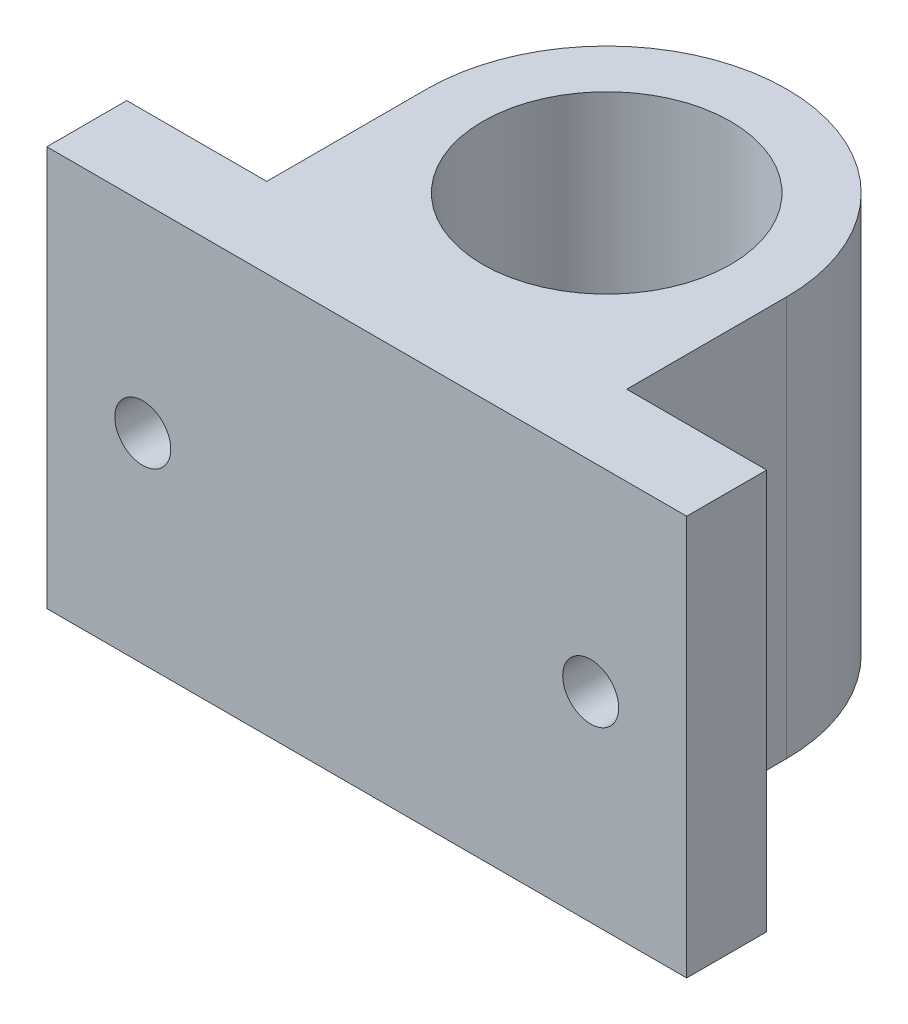
ISO-10303-21;
HEADER;
FILE_DESCRIPTION(('STEP AP214'),'2;1');
FILE_NAME('part.step','',(''),(''),'','','');
FILE_SCHEMA(('AUTOMOTIVE_DESIGN { 1 0 10303 214 1 1 1 1 }'));
ENDSEC;
DATA;
#1=APPLICATION_CONTEXT('core data for automotive mechanical design processes');
#2=APPLICATION_PROTOCOL_DEFINITION('international standard','automotive_design',2000,#1);
#3=PRODUCT_CONTEXT('',#1,'mechanical');
#4=PRODUCT('Part','Part','',(#3));
#5=PRODUCT_RELATED_PRODUCT_CATEGORY('part','',(#4));
#6=PRODUCT_DEFINITION_FORMATION('','',#4);
#7=PRODUCT_DEFINITION_CONTEXT('part definition',#1,'design');
#8=PRODUCT_DEFINITION('design','',#6,#7);
#9=PRODUCT_DEFINITION_SHAPE('','',#8);
#10=(LENGTH_UNIT() NAMED_UNIT(*) SI_UNIT(.MILLI.,.METRE.));
#11=(NAMED_UNIT(*) PLANE_ANGLE_UNIT() SI_UNIT($,.RADIAN.));
#12=(NAMED_UNIT(*) SI_UNIT($,.STERADIAN.) SOLID_ANGLE_UNIT());
#13=UNCERTAINTY_MEASURE_WITH_UNIT(LENGTH_MEASURE(1.E-05),#10,'distance_accuracy_value','');
#14=(GEOMETRIC_REPRESENTATION_CONTEXT(3) GLOBAL_UNCERTAINTY_ASSIGNED_CONTEXT((#13)) GLOBAL_UNIT_ASSIGNED_CONTEXT((#10,
#11,#12)) REPRESENTATION_CONTEXT('',''));
#15=CARTESIAN_POINT('',(0.,0.,0.));
#16=DIRECTION('',(0.,0.,1.));
#17=DIRECTION('',(1.,0.,0.));
#18=AXIS2_PLACEMENT_3D('',#15,#16,#17);
#19=CARTESIAN_POINT('',(21.3440860215054,25.,-11.1129032258065));
#20=DIRECTION('',(0.,1.,0.));
#21=DIRECTION('',(0.,0.,1.));
#22=AXIS2_PLACEMENT_3D('',#19,#20,#21);
#23=PLANE('',#22);
#24=DIRECTION('',(0.,0.,1.));
#25=VECTOR('',#24,1.);
#26=CARTESIAN_POINT('',(1.34408602150537,25.,-1.11290322580645));
#27=LINE('',#26,#25);
#28=CARTESIAN_POINT('',(1.34408602150537,25.,-1.11290322580645));
#29=VERTEX_POINT('',#28);
#30=CARTESIAN_POINT('',(1.34408602150537,25.,3.88709677419355));
#31=VERTEX_POINT('',#30);
#32=EDGE_CURVE('E147',#29,#31,#27,.T.);
#33=ORIENTED_EDGE('',*,*,#32,.T.);
#34=DIRECTION('',(1.,0.,0.));
#35=VECTOR('',#34,1.);
#36=CARTESIAN_POINT('',(1.34408602150537,25.,3.88709677419355));
#37=LINE('',#36,#35);
#38=CARTESIAN_POINT('',(41.3440860215054,25.,3.88709677419355));
#39=VERTEX_POINT('',#38);
#40=EDGE_CURVE('E95',#31,#39,#37,.T.);
#41=ORIENTED_EDGE('',*,*,#40,.T.);
#42=DIRECTION('',(0.,0.,-1.));
#43=VECTOR('',#42,1.);
#44=CARTESIAN_POINT('',(41.3440860215054,25.,-1.11290322580645));
#45=LINE('',#44,#43);
#46=CARTESIAN_POINT('',(41.3440860215054,25.,-1.11290322580645));
#47=VERTEX_POINT('',#46);
#48=EDGE_CURVE('E162',#39,#47,#45,.T.);
#49=ORIENTED_EDGE('',*,*,#48,.T.);
#50=DIRECTION('',(-1.,0.,0.));
#51=VECTOR('',#50,1.);
#52=CARTESIAN_POINT('',(32.5940860215054,25.,-1.11290322580645));
#53=LINE('',#52,#51);
#54=CARTESIAN_POINT('',(32.5940860215054,25.,-1.11290322580645));
#55=VERTEX_POINT('',#54);
#56=EDGE_CURVE('E175',#47,#55,#53,.T.);
#57=ORIENTED_EDGE('',*,*,#56,.T.);
#58=DIRECTION('',(0.,0.,-1.));
#59=VECTOR('',#58,1.);
#60=CARTESIAN_POINT('',(32.5940860215054,25.,-11.1129032258064));
#61=LINE('',#60,#59);
#62=CARTESIAN_POINT('',(32.5940860215054,25.,-11.1129032258065));
#63=VERTEX_POINT('',#62);
#64=EDGE_CURVE('E114',#55,#63,#61,.T.);
#65=ORIENTED_EDGE('',*,*,#64,.T.);
#66=CARTESIAN_POINT('',(21.3440860215054,25.,-11.1129032258065));
#67=DIRECTION('',(0.,1.,0.));
#68=DIRECTION('',(0.,0.,1.));
#69=AXIS2_PLACEMENT_3D('',#66,#67,#68);
#70=CIRCLE('',#69,11.25);
#71=CARTESIAN_POINT('',(10.0940860215054,25.,-11.1129032258064));
#72=VERTEX_POINT('',#71);
#73=EDGE_CURVE('E108',#63,#72,#70,.T.);
#74=ORIENTED_EDGE('',*,*,#73,.T.);
#75=DIRECTION('',(0.,0.,1.));
#76=VECTOR('',#75,1.);
#77=CARTESIAN_POINT('',(10.0940860215054,25.,-11.1129032258064));
#78=LINE('',#77,#76);
#79=CARTESIAN_POINT('',(10.0940860215054,25.,-1.11290322580645));
#80=VERTEX_POINT('',#79);
#81=EDGE_CURVE('E112',#72,#80,#78,.T.);
#82=ORIENTED_EDGE('',*,*,#81,.T.);
#83=DIRECTION('',(-1.,0.,0.));
#84=VECTOR('',#83,1.);
#85=CARTESIAN_POINT('',(1.34408602150537,25.,-1.11290322580645));
#86=LINE('',#85,#84);
#87=EDGE_CURVE('E52',#80,#29,#86,.T.);
#88=ORIENTED_EDGE('',*,*,#87,.T.);
#89=EDGE_LOOP('',(#33,#41,#49,#57,#65,#74,#82,#88));
#90=FACE_BOUND('',#89,.T.);
#91=CARTESIAN_POINT('',(21.3440860215054,25.,-11.1129032258065));
#92=DIRECTION('',(0.,1.,0.));
#93=DIRECTION('',(0.,0.,1.));
#94=AXIS2_PLACEMENT_3D('',#91,#92,#93);
#95=CIRCLE('',#94,7.75);
#96=CARTESIAN_POINT('',(21.3440860215054,25.,-3.36290322580645));
#97=VERTEX_POINT('',#96);
#98=EDGE_CURVE('E136',#97,#97,#95,.T.);
#99=ORIENTED_EDGE('',*,*,#98,.F.);
#100=EDGE_LOOP('',(#99));
#101=FACE_BOUND('',#100,.T.);
#102=ADVANCED_FACE('F35',(#90,#101),#23,.T.);
#103=CARTESIAN_POINT('',(21.3440860215054,0.,-11.1129032258065));
#104=DIRECTION('',(0.,1.,0.));
#105=DIRECTION('',(0.,0.,1.));
#106=AXIS2_PLACEMENT_3D('',#103,#104,#105);
#107=PLANE('',#106);
#108=DIRECTION('',(0.,0.,1.));
#109=VECTOR('',#108,1.);
#110=CARTESIAN_POINT('',(1.34408602150537,0.,-1.11290322580645));
#111=LINE('',#110,#109);
#112=CARTESIAN_POINT('',(1.34408602150537,0.,-1.11290322580645));
#113=VERTEX_POINT('',#112);
#114=CARTESIAN_POINT('',(1.34408602150537,0.,3.88709677419355));
#115=VERTEX_POINT('',#114);
#116=EDGE_CURVE('E132',#113,#115,#111,.T.);
#117=ORIENTED_EDGE('',*,*,#116,.F.);
#118=DIRECTION('',(-1.,0.,0.));
#119=VECTOR('',#118,1.);
#120=CARTESIAN_POINT('',(1.34408602150537,0.,-1.11290322580645));
#121=LINE('',#120,#119);
#122=CARTESIAN_POINT('',(10.0940860215054,0.,-1.11290322580645));
#123=VERTEX_POINT('',#122);
#124=EDGE_CURVE('E87',#123,#113,#121,.T.);
#125=ORIENTED_EDGE('',*,*,#124,.F.);
#126=DIRECTION('',(0.,0.,1.));
#127=VECTOR('',#126,1.);
#128=CARTESIAN_POINT('',(10.0940860215054,0.,-11.1129032258064));
#129=LINE('',#128,#127);
#130=CARTESIAN_POINT('',(10.0940860215054,0.,-11.1129032258064));
#131=VERTEX_POINT('',#130);
#132=EDGE_CURVE('E81',#131,#123,#129,.T.);
#133=ORIENTED_EDGE('',*,*,#132,.F.);
#134=CARTESIAN_POINT('',(21.3440860215054,0.,-11.1129032258065));
#135=DIRECTION('',(0.,1.,0.));
#136=DIRECTION('',(0.,0.,1.));
#137=AXIS2_PLACEMENT_3D('',#134,#135,#136);
#138=CIRCLE('',#137,11.25);
#139=CARTESIAN_POINT('',(32.5940860215054,0.,-11.1129032258065));
#140=VERTEX_POINT('',#139);
#141=EDGE_CURVE('E122',#140,#131,#138,.T.);
#142=ORIENTED_EDGE('',*,*,#141,.F.);
#143=DIRECTION('',(0.,0.,-1.));
#144=VECTOR('',#143,1.);
#145=CARTESIAN_POINT('',(32.5940860215054,0.,-11.1129032258064));
#146=LINE('',#145,#144);
#147=CARTESIAN_POINT('',(32.5940860215054,0.,-1.11290322580645));
#148=VERTEX_POINT('',#147);
#149=EDGE_CURVE('E142',#148,#140,#146,.T.);
#150=ORIENTED_EDGE('',*,*,#149,.F.);
#151=DIRECTION('',(-1.,0.,0.));
#152=VECTOR('',#151,1.);
#153=CARTESIAN_POINT('',(32.5940860215054,0.,-1.11290322580645));
#154=LINE('',#153,#152);
#155=CARTESIAN_POINT('',(41.3440860215054,0.,-1.11290322580645));
#156=VERTEX_POINT('',#155);
#157=EDGE_CURVE('E140',#156,#148,#154,.T.);
#158=ORIENTED_EDGE('',*,*,#157,.F.);
#159=DIRECTION('',(0.,0.,-1.));
#160=VECTOR('',#159,1.);
#161=CARTESIAN_POINT('',(41.3440860215054,0.,-1.11290322580645));
#162=LINE('',#161,#160);
#163=CARTESIAN_POINT('',(41.3440860215054,0.,3.88709677419355));
#164=VERTEX_POINT('',#163);
#165=EDGE_CURVE('E138',#164,#156,#162,.T.);
#166=ORIENTED_EDGE('',*,*,#165,.F.);
#167=DIRECTION('',(1.,0.,0.));
#168=VECTOR('',#167,1.);
#169=CARTESIAN_POINT('',(1.34408602150537,0.,3.88709677419355));
#170=LINE('',#169,#168);
#171=EDGE_CURVE('E135',#115,#164,#170,.T.);
#172=ORIENTED_EDGE('',*,*,#171,.F.);
#173=EDGE_LOOP('',(#117,#125,#133,#142,#150,#158,#166,#172));
#174=FACE_BOUND('',#173,.T.);
#175=CARTESIAN_POINT('',(21.3440860215054,0.,-11.1129032258065));
#176=DIRECTION('',(0.,1.,0.));
#177=DIRECTION('',(0.,0.,1.));
#178=AXIS2_PLACEMENT_3D('',#175,#176,#177);
#179=CIRCLE('',#178,7.75);
#180=CARTESIAN_POINT('',(21.3440860215054,0.,-3.36290322580645));
#181=VERTEX_POINT('',#180);
#182=EDGE_CURVE('E181',#181,#181,#179,.T.);
#183=ORIENTED_EDGE('',*,*,#182,.T.);
#184=EDGE_LOOP('',(#183));
#185=FACE_BOUND('',#184,.T.);
#186=ADVANCED_FACE('F166',(#174,#185),#107,.F.);
#187=CARTESIAN_POINT('',(1.34408602150537,25.,-1.11290322580645));
#188=DIRECTION('',(1.,0.,0.));
#189=DIRECTION('',(0.,0.,-1.));
#190=AXIS2_PLACEMENT_3D('',#187,#188,#189);
#191=PLANE('',#190);
#192=ORIENTED_EDGE('',*,*,#116,.T.);
#193=DIRECTION('',(0.,-1.,0.));
#194=VECTOR('',#193,1.);
#195=CARTESIAN_POINT('',(1.34408602150537,25.,3.88709677419355));
#196=LINE('',#195,#194);
#197=EDGE_CURVE('E11',#31,#115,#196,.T.);
#198=ORIENTED_EDGE('',*,*,#197,.F.);
#199=ORIENTED_EDGE('',*,*,#32,.F.);
#200=DIRECTION('',(0.,-1.,0.));
#201=VECTOR('',#200,1.);
#202=CARTESIAN_POINT('',(1.34408602150537,25.,-1.11290322580645));
#203=LINE('',#202,#201);
#204=EDGE_CURVE('E128',#29,#113,#203,.T.);
#205=ORIENTED_EDGE('',*,*,#204,.T.);
#206=EDGE_LOOP('',(#192,#198,#199,#205));
#207=FACE_BOUND('',#206,.T.);
#208=ADVANCED_FACE('F37',(#207),#191,.F.);
#209=CARTESIAN_POINT('',(1.34408602150537,25.,3.88709677419355));
#210=DIRECTION('',(0.,0.,-1.));
#211=DIRECTION('',(-1.,0.,0.));
#212=AXIS2_PLACEMENT_3D('',#209,#210,#211);
#213=PLANE('',#212);
#214=CARTESIAN_POINT('',(35.3440860215054,12.5,3.88709677419355));
#215=DIRECTION('',(0.,0.,-1.));
#216=DIRECTION('',(-1.,0.,0.));
#217=AXIS2_PLACEMENT_3D('',#214,#215,#216);
#218=CIRCLE('',#217,1.75);
#219=CARTESIAN_POINT('',(33.5940860215054,12.5,3.88709677419355));
#220=VERTEX_POINT('',#219);
#221=EDGE_CURVE('E184',#220,#220,#218,.T.);
#222=ORIENTED_EDGE('',*,*,#221,.T.);
#223=EDGE_LOOP('',(#222));
#224=FACE_BOUND('',#223,.T.);
#225=CARTESIAN_POINT('',(7.34408602150538,12.5,3.88709677419355));
#226=DIRECTION('',(0.,0.,-1.));
#227=DIRECTION('',(-1.,0.,0.));
#228=AXIS2_PLACEMENT_3D('',#225,#226,#227);
#229=CIRCLE('',#228,1.75);
#230=CARTESIAN_POINT('',(5.59408602150538,12.5,3.88709677419355));
#231=VERTEX_POINT('',#230);
#232=EDGE_CURVE('E190',#231,#231,#229,.T.);
#233=ORIENTED_EDGE('',*,*,#232,.T.);
#234=EDGE_LOOP('',(#233));
#235=FACE_BOUND('',#234,.T.);
#236=ORIENTED_EDGE('',*,*,#171,.T.);
#237=DIRECTION('',(0.,-1.,0.));
#238=VECTOR('',#237,1.);
#239=CARTESIAN_POINT('',(41.3440860215054,25.,3.88709677419355));
#240=LINE('',#239,#238);
#241=EDGE_CURVE('E44',#39,#164,#240,.T.);
#242=ORIENTED_EDGE('',*,*,#241,.F.);
#243=ORIENTED_EDGE('',*,*,#40,.F.);
#244=ORIENTED_EDGE('',*,*,#197,.T.);
#245=EDGE_LOOP('',(#236,#242,#243,#244));
#246=FACE_BOUND('',#245,.T.);
#247=ADVANCED_FACE('F199',(#224,#235,#246),#213,.F.);
#248=CARTESIAN_POINT('',(41.3440860215054,25.,-1.11290322580645));
#249=DIRECTION('',(-1.,0.,0.));
#250=DIRECTION('',(0.,0.,1.));
#251=AXIS2_PLACEMENT_3D('',#248,#249,#250);
#252=PLANE('',#251);
#253=ORIENTED_EDGE('',*,*,#165,.T.);
#254=DIRECTION('',(0.,-1.,0.));
#255=VECTOR('',#254,1.);
#256=CARTESIAN_POINT('',(41.3440860215054,25.,-1.11290322580645));
#257=LINE('',#256,#255);
#258=EDGE_CURVE('E154',#47,#156,#257,.T.);
#259=ORIENTED_EDGE('',*,*,#258,.F.);
#260=ORIENTED_EDGE('',*,*,#48,.F.);
#261=ORIENTED_EDGE('',*,*,#241,.T.);
#262=EDGE_LOOP('',(#253,#259,#260,#261));
#263=FACE_BOUND('',#262,.T.);
#264=ADVANCED_FACE('F160',(#263),#252,.F.);
#265=CARTESIAN_POINT('',(32.5940860215054,25.,-1.11290322580645));
#266=DIRECTION('',(0.,0.,1.));
#267=DIRECTION('',(1.,0.,0.));
#268=AXIS2_PLACEMENT_3D('',#265,#266,#267);
#269=PLANE('',#268);
#270=CARTESIAN_POINT('',(35.3440860215054,12.5,-1.11290322580645));
#271=DIRECTION('',(0.,0.,-1.));
#272=DIRECTION('',(-1.,0.,0.));
#273=AXIS2_PLACEMENT_3D('',#270,#271,#272);
#274=CIRCLE('',#273,1.75);
#275=CARTESIAN_POINT('',(33.5940860215054,12.5,-1.11290322580645));
#276=VERTEX_POINT('',#275);
#277=EDGE_CURVE('E193',#276,#276,#274,.T.);
#278=ORIENTED_EDGE('',*,*,#277,.F.);
#279=EDGE_LOOP('',(#278));
#280=FACE_BOUND('',#279,.T.);
#281=ORIENTED_EDGE('',*,*,#157,.T.);
#282=DIRECTION('',(0.,-1.,0.));
#283=VECTOR('',#282,1.);
#284=CARTESIAN_POINT('',(32.5940860215054,25.,-1.11290322580645));
#285=LINE('',#284,#283);
#286=EDGE_CURVE('E151',#55,#148,#285,.T.);
#287=ORIENTED_EDGE('',*,*,#286,.F.);
#288=ORIENTED_EDGE('',*,*,#56,.F.);
#289=ORIENTED_EDGE('',*,*,#258,.T.);
#290=EDGE_LOOP('',(#281,#287,#288,#289));
#291=FACE_BOUND('',#290,.T.);
#292=ADVANCED_FACE('F171',(#280,#291),#269,.F.);
#293=CARTESIAN_POINT('',(32.5940860215054,25.,-11.1129032258064));
#294=DIRECTION('',(-1.,0.,0.));
#295=DIRECTION('',(0.,0.,1.));
#296=AXIS2_PLACEMENT_3D('',#293,#294,#295);
#297=PLANE('',#296);
#298=ORIENTED_EDGE('',*,*,#149,.T.);
#299=DIRECTION('',(0.,-1.,0.));
#300=VECTOR('',#299,1.);
#301=CARTESIAN_POINT('',(32.5940860215054,25.,-11.1129032258065));
#302=LINE('',#301,#300);
#303=EDGE_CURVE('E123',#63,#140,#302,.T.);
#304=ORIENTED_EDGE('',*,*,#303,.F.);
#305=ORIENTED_EDGE('',*,*,#64,.F.);
#306=ORIENTED_EDGE('',*,*,#286,.T.);
#307=EDGE_LOOP('',(#298,#304,#305,#306));
#308=FACE_BOUND('',#307,.T.);
#309=ADVANCED_FACE('F174',(#308),#297,.F.);
#310=CARTESIAN_POINT('',(21.3440860215054,25.,-11.1129032258065));
#311=DIRECTION('',(0.,-1.,0.));
#312=DIRECTION('',(0.,0.,-1.));
#313=AXIS2_PLACEMENT_3D('',#310,#311,#312);
#314=CYLINDRICAL_SURFACE('',#313,11.25);
#315=ORIENTED_EDGE('',*,*,#141,.T.);
#316=DIRECTION('',(0.,-1.,0.));
#317=VECTOR('',#316,1.);
#318=CARTESIAN_POINT('',(10.0940860215054,25.,-11.1129032258064));
#319=LINE('',#318,#317);
#320=EDGE_CURVE('E119',#72,#131,#319,.T.);
#321=ORIENTED_EDGE('',*,*,#320,.F.);
#322=ORIENTED_EDGE('',*,*,#73,.F.);
#323=ORIENTED_EDGE('',*,*,#303,.T.);
#324=EDGE_LOOP('',(#315,#321,#322,#323));
#325=FACE_BOUND('',#324,.T.);
#326=ADVANCED_FACE('F120',(#325),#314,.T.);
#327=CARTESIAN_POINT('',(10.0940860215054,25.,-11.1129032258064));
#328=DIRECTION('',(1.,0.,0.));
#329=DIRECTION('',(0.,0.,-1.));
#330=AXIS2_PLACEMENT_3D('',#327,#328,#329);
#331=PLANE('',#330);
#332=ORIENTED_EDGE('',*,*,#132,.T.);
#333=DIRECTION('',(0.,-1.,0.));
#334=VECTOR('',#333,1.);
#335=CARTESIAN_POINT('',(10.0940860215054,25.,-1.11290322580645));
#336=LINE('',#335,#334);
#337=EDGE_CURVE('E124',#80,#123,#336,.T.);
#338=ORIENTED_EDGE('',*,*,#337,.F.);
#339=ORIENTED_EDGE('',*,*,#81,.F.);
#340=ORIENTED_EDGE('',*,*,#320,.T.);
#341=EDGE_LOOP('',(#332,#338,#339,#340));
#342=FACE_BOUND('',#341,.T.);
#343=ADVANCED_FACE('F126',(#342),#331,.F.);
#344=CARTESIAN_POINT('',(1.34408602150537,25.,-1.11290322580645));
#345=DIRECTION('',(0.,0.,1.));
#346=DIRECTION('',(1.,0.,0.));
#347=AXIS2_PLACEMENT_3D('',#344,#345,#346);
#348=PLANE('',#347);
#349=CARTESIAN_POINT('',(7.34408602150538,12.5,-1.11290322580645));
#350=DIRECTION('',(0.,0.,-1.));
#351=DIRECTION('',(-1.,0.,0.));
#352=AXIS2_PLACEMENT_3D('',#349,#350,#351);
#353=CIRCLE('',#352,1.75);
#354=CARTESIAN_POINT('',(5.59408602150538,12.5,-1.11290322580645));
#355=VERTEX_POINT('',#354);
#356=EDGE_CURVE('E187',#355,#355,#353,.T.);
#357=ORIENTED_EDGE('',*,*,#356,.F.);
#358=EDGE_LOOP('',(#357));
#359=FACE_BOUND('',#358,.T.);
#360=ORIENTED_EDGE('',*,*,#124,.T.);
#361=ORIENTED_EDGE('',*,*,#204,.F.);
#362=ORIENTED_EDGE('',*,*,#87,.F.);
#363=ORIENTED_EDGE('',*,*,#337,.T.);
#364=EDGE_LOOP('',(#360,#361,#362,#363));
#365=FACE_BOUND('',#364,.T.);
#366=ADVANCED_FACE('F227',(#359,#365),#348,.F.);
#367=CARTESIAN_POINT('',(21.3440860215054,25.,-11.1129032258065));
#368=DIRECTION('',(0.,-1.,0.));
#369=DIRECTION('',(0.,0.,-1.));
#370=AXIS2_PLACEMENT_3D('',#367,#368,#369);
#371=CYLINDRICAL_SURFACE('',#370,7.75);
#372=ORIENTED_EDGE('',*,*,#98,.T.);
#373=EDGE_LOOP('',(#372));
#374=FACE_BOUND('',#373,.T.);
#375=ORIENTED_EDGE('',*,*,#182,.F.);
#376=EDGE_LOOP('',(#375));
#377=FACE_BOUND('',#376,.T.);
#378=ADVANCED_FACE('F224',(#374,#377),#371,.F.);
#379=CARTESIAN_POINT('',(7.34408602150538,12.5,3.88709677419355));
#380=DIRECTION('',(0.,0.,-1.));
#381=DIRECTION('',(-1.,0.,0.));
#382=AXIS2_PLACEMENT_3D('',#379,#380,#381);
#383=CYLINDRICAL_SURFACE('',#382,1.75);
#384=CARTESIAN_POINT('',(5.59408602150538,12.5,3.88709677419355));
#385=CARTESIAN_POINT('',(5.59408602150538,12.5,3.83501344086022));
#386=CARTESIAN_POINT('',(5.59408602150538,12.5,3.78293010752688));
#387=CARTESIAN_POINT('',(5.59408602150538,12.5,3.67876344086022));
#388=CARTESIAN_POINT('',(5.59408602150538,12.5,3.62668010752688));
#389=CARTESIAN_POINT('',(5.59408602150538,12.5,3.52251344086022));
#390=CARTESIAN_POINT('',(5.59408602150538,12.5,3.47043010752688));
#391=CARTESIAN_POINT('',(5.59408602150538,12.5,3.36626344086022));
#392=CARTESIAN_POINT('',(5.59408602150538,12.5,3.31418010752688));
#393=CARTESIAN_POINT('',(5.59408602150538,12.5,3.21001344086022));
#394=CARTESIAN_POINT('',(5.59408602150538,12.5,3.15793010752688));
#395=CARTESIAN_POINT('',(5.59408602150538,12.5,3.05376344086022));
#396=CARTESIAN_POINT('',(5.59408602150538,12.5,3.00168010752688));
#397=CARTESIAN_POINT('',(5.59408602150538,12.5,2.89751344086022));
#398=CARTESIAN_POINT('',(5.59408602150538,12.5,2.84543010752688));
#399=CARTESIAN_POINT('',(5.59408602150538,12.5,2.74126344086022));
#400=CARTESIAN_POINT('',(5.59408602150538,12.5,2.68918010752688));
#401=CARTESIAN_POINT('',(5.59408602150538,12.5,2.58501344086022));
#402=CARTESIAN_POINT('',(5.59408602150538,12.5,2.53293010752688));
#403=CARTESIAN_POINT('',(5.59408602150538,12.5,2.42876344086022));
#404=CARTESIAN_POINT('',(5.59408602150538,12.5,2.37668010752688));
#405=CARTESIAN_POINT('',(5.59408602150538,12.5,2.27251344086022));
#406=CARTESIAN_POINT('',(5.59408602150538,12.5,2.22043010752688));
#407=CARTESIAN_POINT('',(5.59408602150538,12.5,2.11626344086022));
#408=CARTESIAN_POINT('',(5.59408602150538,12.5,2.06418010752688));
#409=CARTESIAN_POINT('',(5.59408602150538,12.5,1.96001344086022));
#410=CARTESIAN_POINT('',(5.59408602150538,12.5,1.90793010752688));
#411=CARTESIAN_POINT('',(5.59408602150538,12.5,1.80376344086022));
#412=CARTESIAN_POINT('',(5.59408602150538,12.5,1.75168010752688));
#413=CARTESIAN_POINT('',(5.59408602150538,12.5,1.64751344086022));
#414=CARTESIAN_POINT('',(5.59408602150538,12.5,1.59543010752688));
#415=CARTESIAN_POINT('',(5.59408602150538,12.5,1.49126344086022));
#416=CARTESIAN_POINT('',(5.59408602150538,12.5,1.43918010752688));
#417=CARTESIAN_POINT('',(5.59408602150538,12.5,1.33501344086022));
#418=CARTESIAN_POINT('',(5.59408602150538,12.5,1.28293010752688));
#419=CARTESIAN_POINT('',(5.59408602150538,12.5,1.17876344086022));
#420=CARTESIAN_POINT('',(5.59408602150538,12.5,1.12668010752688));
#421=CARTESIAN_POINT('',(5.59408602150538,12.5,1.02251344086022));
#422=CARTESIAN_POINT('',(5.59408602150538,12.5,0.970430107526882));
#423=CARTESIAN_POINT('',(5.59408602150538,12.5,0.866263440860215));
#424=CARTESIAN_POINT('',(5.59408602150538,12.5,0.814180107526881));
#425=CARTESIAN_POINT('',(5.59408602150538,12.5,0.710013440860215));
#426=CARTESIAN_POINT('',(5.59408602150538,12.5,0.657930107526882));
#427=CARTESIAN_POINT('',(5.59408602150538,12.5,0.553763440860215));
#428=CARTESIAN_POINT('',(5.59408602150538,12.5,0.501680107526882));
#429=CARTESIAN_POINT('',(5.59408602150538,12.5,0.397513440860215));
#430=CARTESIAN_POINT('',(5.59408602150538,12.5,0.345430107526881));
#431=CARTESIAN_POINT('',(5.59408602150538,12.5,0.241263440860215));
#432=CARTESIAN_POINT('',(5.59408602150538,12.5,0.189180107526881));
#433=CARTESIAN_POINT('',(5.59408602150538,12.5,0.085013440860215));
#434=CARTESIAN_POINT('',(5.59408602150538,12.5,0.0329301075268821));
#435=CARTESIAN_POINT('',(5.59408602150538,12.5,-0.0712365591397842));
#436=CARTESIAN_POINT('',(5.59408602150538,12.5,-0.123319892473118));
#437=CARTESIAN_POINT('',(5.59408602150538,12.5,-0.227486559139784));
#438=CARTESIAN_POINT('',(5.59408602150538,12.5,-0.279569892473118));
#439=CARTESIAN_POINT('',(5.59408602150538,12.5,-0.383736559139784));
#440=CARTESIAN_POINT('',(5.59408602150538,12.5,-0.435819892473118));
#441=CARTESIAN_POINT('',(5.59408602150538,12.5,-0.539986559139785));
#442=CARTESIAN_POINT('',(5.59408602150538,12.5,-0.592069892473118));
#443=CARTESIAN_POINT('',(5.59408602150538,12.5,-0.696236559139785));
#444=CARTESIAN_POINT('',(5.59408602150538,12.5,-0.748319892473118));
#445=CARTESIAN_POINT('',(5.59408602150538,12.5,-0.852486559139785));
#446=CARTESIAN_POINT('',(5.59408602150538,12.5,-0.904569892473118));
#447=CARTESIAN_POINT('',(5.59408602150538,12.5,-1.00873655913979));
#448=CARTESIAN_POINT('',(5.59408602150538,12.5,-1.06081989247312));
#449=CARTESIAN_POINT('',(5.59408602150538,12.5,-1.11290322580645));
#450=B_SPLINE_CURVE_WITH_KNOTS('',3,(#384,#385,#386,#387,#388,#389,#390,#391,#392,#393,#394,
#395,#396,#397,#398,#399,#400,#401,#402,#403,#404,#405,#406,#407,#408,#409,#410,#411,#412,#413,
#414,#415,#416,#417,#418,#419,#420,#421,#422,#423,#424,#425,#426,#427,#428,#429,#430,#431,#432,
#433,#434,#435,#436,#437,#438,#439,#440,#441,#442,#443,#444,#445,#446,#447,#448,#449),
.UNSPECIFIED.,.F.,.F.,(4,2,2,2,2,2,2,2,2,2,2,2,2,2,2,2,2,2,2,2,2,2,2,2,2,2,2,2,2,2,2,2,4),(0.,
0.15625,0.3125,0.46875,0.625,0.78125,0.9375,1.09375,1.25,1.40625,1.5625,1.71875,1.875,2.03125,
2.1875,2.34375,2.5,2.65625,2.8125,2.96875,3.125,3.28125,3.4375,3.59375,3.75,3.90625,4.0625,
4.21875,4.375,4.53125,4.6875,4.84375,5.),.UNSPECIFIED.);
#451=EDGE_CURVE('BSEAM205',#231,#355,#450,.T.);
#452=ORIENTED_EDGE('',*,*,#232,.F.);
#453=ORIENTED_EDGE('',*,*,#356,.T.);
#454=ORIENTED_EDGE('',*,*,#451,.T.);
#455=ORIENTED_EDGE('',*,*,#451,.F.);
#456=EDGE_LOOP('',(#452,#454,#453,#455));
#457=FACE_BOUND('',#456,.T.);
#458=ADVANCED_FACE('F205',(#457),#383,.F.);
#459=CARTESIAN_POINT('',(35.3440860215054,12.5,3.88709677419355));
#460=DIRECTION('',(0.,0.,-1.));
#461=DIRECTION('',(-1.,0.,0.));
#462=AXIS2_PLACEMENT_3D('',#459,#460,#461);
#463=CYLINDRICAL_SURFACE('',#462,1.75);
#464=CARTESIAN_POINT('',(33.5940860215054,12.5,3.88709677419355));
#465=CARTESIAN_POINT('',(33.5940860215054,12.5,3.83501344086022));
#466=CARTESIAN_POINT('',(33.5940860215054,12.5,3.78293010752688));
#467=CARTESIAN_POINT('',(33.5940860215054,12.5,3.67876344086022));
#468=CARTESIAN_POINT('',(33.5940860215054,12.5,3.62668010752688));
#469=CARTESIAN_POINT('',(33.5940860215054,12.5,3.52251344086022));
#470=CARTESIAN_POINT('',(33.5940860215054,12.5,3.47043010752688));
#471=CARTESIAN_POINT('',(33.5940860215054,12.5,3.36626344086022));
#472=CARTESIAN_POINT('',(33.5940860215054,12.5,3.31418010752688));
#473=CARTESIAN_POINT('',(33.5940860215054,12.5,3.21001344086022));
#474=CARTESIAN_POINT('',(33.5940860215054,12.5,3.15793010752688));
#475=CARTESIAN_POINT('',(33.5940860215054,12.5,3.05376344086022));
#476=CARTESIAN_POINT('',(33.5940860215054,12.5,3.00168010752688));
#477=CARTESIAN_POINT('',(33.5940860215054,12.5,2.89751344086022));
#478=CARTESIAN_POINT('',(33.5940860215054,12.5,2.84543010752688));
#479=CARTESIAN_POINT('',(33.5940860215054,12.5,2.74126344086022));
#480=CARTESIAN_POINT('',(33.5940860215054,12.5,2.68918010752688));
#481=CARTESIAN_POINT('',(33.5940860215054,12.5,2.58501344086022));
#482=CARTESIAN_POINT('',(33.5940860215054,12.5,2.53293010752688));
#483=CARTESIAN_POINT('',(33.5940860215054,12.5,2.42876344086022));
#484=CARTESIAN_POINT('',(33.5940860215054,12.5,2.37668010752688));
#485=CARTESIAN_POINT('',(33.5940860215054,12.5,2.27251344086022));
#486=CARTESIAN_POINT('',(33.5940860215054,12.5,2.22043010752688));
#487=CARTESIAN_POINT('',(33.5940860215054,12.5,2.11626344086022));
#488=CARTESIAN_POINT('',(33.5940860215054,12.5,2.06418010752688));
#489=CARTESIAN_POINT('',(33.5940860215054,12.5,1.96001344086022));
#490=CARTESIAN_POINT('',(33.5940860215054,12.5,1.90793010752688));
#491=CARTESIAN_POINT('',(33.5940860215054,12.5,1.80376344086022));
#492=CARTESIAN_POINT('',(33.5940860215054,12.5,1.75168010752688));
#493=CARTESIAN_POINT('',(33.5940860215054,12.5,1.64751344086022));
#494=CARTESIAN_POINT('',(33.5940860215054,12.5,1.59543010752688));
#495=CARTESIAN_POINT('',(33.5940860215054,12.5,1.49126344086022));
#496=CARTESIAN_POINT('',(33.5940860215054,12.5,1.43918010752688));
#497=CARTESIAN_POINT('',(33.5940860215054,12.5,1.33501344086022));
#498=CARTESIAN_POINT('',(33.5940860215054,12.5,1.28293010752688));
#499=CARTESIAN_POINT('',(33.5940860215054,12.5,1.17876344086022));
#500=CARTESIAN_POINT('',(33.5940860215054,12.5,1.12668010752688));
#501=CARTESIAN_POINT('',(33.5940860215054,12.5,1.02251344086022));
#502=CARTESIAN_POINT('',(33.5940860215054,12.5,0.970430107526882));
#503=CARTESIAN_POINT('',(33.5940860215054,12.5,0.866263440860216));
#504=CARTESIAN_POINT('',(33.5940860215054,12.5,0.814180107526882));
#505=CARTESIAN_POINT('',(33.5940860215054,12.5,0.710013440860216));
#506=CARTESIAN_POINT('',(33.5940860215054,12.5,0.657930107526883));
#507=CARTESIAN_POINT('',(33.5940860215054,12.5,0.553763440860216));
#508=CARTESIAN_POINT('',(33.5940860215054,12.5,0.501680107526883));
#509=CARTESIAN_POINT('',(33.5940860215054,12.5,0.397513440860216));
#510=CARTESIAN_POINT('',(33.5940860215054,12.5,0.345430107526882));
#511=CARTESIAN_POINT('',(33.5940860215054,12.5,0.241263440860216));
#512=CARTESIAN_POINT('',(33.5940860215054,12.5,0.189180107526882));
#513=CARTESIAN_POINT('',(33.5940860215054,12.5,0.0850134408602159));
#514=CARTESIAN_POINT('',(33.5940860215054,12.5,0.032930107526883));
#515=CARTESIAN_POINT('',(33.5940860215054,12.5,-0.0712365591397834));
#516=CARTESIAN_POINT('',(33.5940860215054,12.5,-0.123319892473117));
#517=CARTESIAN_POINT('',(33.5940860215054,12.5,-0.227486559139783));
#518=CARTESIAN_POINT('',(33.5940860215054,12.5,-0.279569892473117));
#519=CARTESIAN_POINT('',(33.5940860215054,12.5,-0.383736559139784));
#520=CARTESIAN_POINT('',(33.5940860215054,12.5,-0.435819892473117));
#521=CARTESIAN_POINT('',(33.5940860215054,12.5,-0.539986559139784));
#522=CARTESIAN_POINT('',(33.5940860215054,12.5,-0.592069892473117));
#523=CARTESIAN_POINT('',(33.5940860215054,12.5,-0.696236559139784));
#524=CARTESIAN_POINT('',(33.5940860215054,12.5,-0.748319892473117));
#525=CARTESIAN_POINT('',(33.5940860215054,12.5,-0.852486559139784));
#526=CARTESIAN_POINT('',(33.5940860215054,12.5,-0.904569892473117));
#527=CARTESIAN_POINT('',(33.5940860215054,12.5,-1.00873655913978));
#528=CARTESIAN_POINT('',(33.5940860215054,12.5,-1.06081989247312));
#529=CARTESIAN_POINT('',(33.5940860215054,12.5,-1.11290322580645));
#530=B_SPLINE_CURVE_WITH_KNOTS('',3,(#464,#465,#466,#467,#468,#469,#470,#471,#472,#473,#474,
#475,#476,#477,#478,#479,#480,#481,#482,#483,#484,#485,#486,#487,#488,#489,#490,#491,#492,#493,
#494,#495,#496,#497,#498,#499,#500,#501,#502,#503,#504,#505,#506,#507,#508,#509,#510,#511,#512,
#513,#514,#515,#516,#517,#518,#519,#520,#521,#522,#523,#524,#525,#526,#527,#528,#529),
.UNSPECIFIED.,.F.,.F.,(4,2,2,2,2,2,2,2,2,2,2,2,2,2,2,2,2,2,2,2,2,2,2,2,2,2,2,2,2,2,2,2,4),(0.,
0.15625,0.3125,0.46875,0.625,0.78125,0.9375,1.09375,1.25,1.40625,1.5625,1.71875,1.875,2.03125,
2.1875,2.34375,2.5,2.65625,2.8125,2.96875,3.125,3.28125,3.4375,3.59375,3.75,3.90625,4.0625,
4.21875,4.375,4.53125,4.6875,4.84375,5.),.UNSPECIFIED.);
#531=EDGE_CURVE('BSEAM202',#220,#276,#530,.T.);
#532=ORIENTED_EDGE('',*,*,#221,.F.);
#533=ORIENTED_EDGE('',*,*,#277,.T.);
#534=ORIENTED_EDGE('',*,*,#531,.T.);
#535=ORIENTED_EDGE('',*,*,#531,.F.);
#536=EDGE_LOOP('',(#532,#534,#533,#535));
#537=FACE_BOUND('',#536,.T.);
#538=ADVANCED_FACE('F202',(#537),#463,.F.);
#539=CLOSED_SHELL('',(#102,#186,#208,#247,#264,#292,#309,#326,#343,#366,#378,#458,#538));
#540=MANIFOLD_SOLID_BREP('B2',#539);
#541=ADVANCED_BREP_SHAPE_REPRESENTATION('',(#18,#540),#14);
#542=SHAPE_DEFINITION_REPRESENTATION(#9,#541);
ENDSEC;
END-ISO-10303-21;
